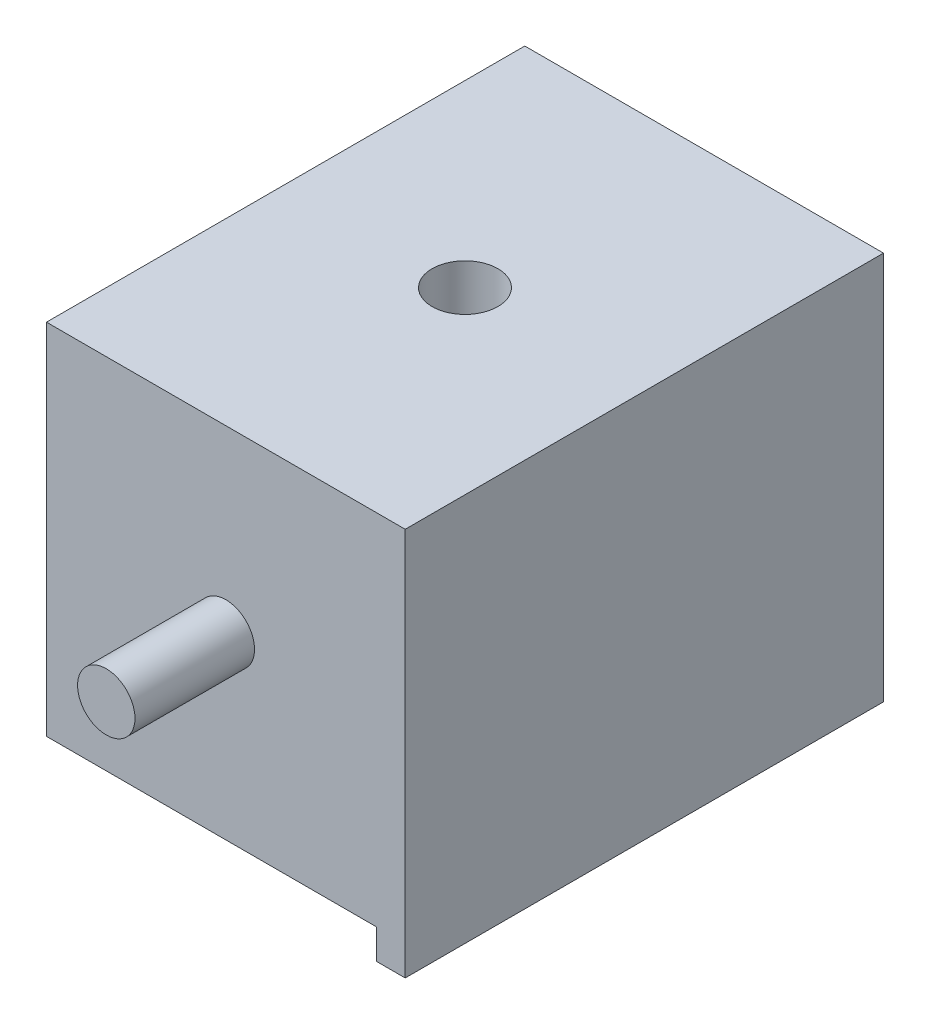
ISO-10303-21;
HEADER;
FILE_DESCRIPTION(('STEP AP214'),'2;1');
FILE_NAME('part.step','',(''),(''),'','','');
FILE_SCHEMA(('AUTOMOTIVE_DESIGN { 1 0 10303 214 1 1 1 1 }'));
ENDSEC;
DATA;
#1=APPLICATION_CONTEXT('core data for automotive mechanical design processes');
#2=APPLICATION_PROTOCOL_DEFINITION('international standard','automotive_design',2000,#1);
#3=PRODUCT_CONTEXT('',#1,'mechanical');
#4=PRODUCT('Part','Part','',(#3));
#5=PRODUCT_RELATED_PRODUCT_CATEGORY('part','',(#4));
#6=PRODUCT_DEFINITION_FORMATION('','',#4);
#7=PRODUCT_DEFINITION_CONTEXT('part definition',#1,'design');
#8=PRODUCT_DEFINITION('design','',#6,#7);
#9=PRODUCT_DEFINITION_SHAPE('','',#8);
#10=(LENGTH_UNIT() NAMED_UNIT(*) SI_UNIT(.MILLI.,.METRE.));
#11=(NAMED_UNIT(*) PLANE_ANGLE_UNIT() SI_UNIT($,.RADIAN.));
#12=(NAMED_UNIT(*) SI_UNIT($,.STERADIAN.) SOLID_ANGLE_UNIT());
#13=UNCERTAINTY_MEASURE_WITH_UNIT(LENGTH_MEASURE(1.E-05),#10,'distance_accuracy_value','');
#14=(GEOMETRIC_REPRESENTATION_CONTEXT(3) GLOBAL_UNCERTAINTY_ASSIGNED_CONTEXT((#13)) GLOBAL_UNIT_ASSIGNED_CONTEXT((#10,
#11,#12)) REPRESENTATION_CONTEXT('',''));
#15=CARTESIAN_POINT('',(0.,0.,0.));
#16=DIRECTION('',(0.,0.,1.));
#17=DIRECTION('',(1.,0.,0.));
#18=AXIS2_PLACEMENT_3D('',#15,#16,#17);
#19=CARTESIAN_POINT('',(-19.05,-19.05,25.4));
#20=DIRECTION('',(0.,1.,0.));
#21=DIRECTION('',(0.,0.,1.));
#22=AXIS2_PLACEMENT_3D('',#19,#20,#21);
#23=PLANE('',#22);
#24=CARTESIAN_POINT('',(0.,-19.05,0.));
#25=DIRECTION('',(0.,-1.,0.));
#26=DIRECTION('',(0.,0.,-1.));
#27=AXIS2_PLACEMENT_3D('',#24,#25,#26);
#28=CIRCLE('',#27,3.4925);
#29=CARTESIAN_POINT('',(0.,-19.05,-3.4925));
#30=VERTEX_POINT('',#29);
#31=EDGE_CURVE('E123',#30,#30,#28,.T.);
#32=ORIENTED_EDGE('',*,*,#31,.F.);
#33=EDGE_LOOP('',(#32));
#34=FACE_BOUND('',#33,.T.);
#35=DIRECTION('',(0.,0.,-1.));
#36=VECTOR('',#35,1.);
#37=CARTESIAN_POINT('',(16.002,-19.05,-25.4));
#38=LINE('',#37,#36);
#39=CARTESIAN_POINT('',(16.002,-19.05,25.4));
#40=VERTEX_POINT('',#39);
#41=CARTESIAN_POINT('',(16.002,-19.05,-25.4));
#42=VERTEX_POINT('',#41);
#43=EDGE_CURVE('E50',#40,#42,#38,.T.);
#44=ORIENTED_EDGE('',*,*,#43,.F.);
#45=DIRECTION('',(1.,0.,0.));
#46=VECTOR('',#45,1.);
#47=CARTESIAN_POINT('',(-19.05,-19.05,25.4));
#48=LINE('',#47,#46);
#49=CARTESIAN_POINT('',(-19.05,-19.05,25.4));
#50=VERTEX_POINT('',#49);
#51=EDGE_CURVE('E138',#50,#40,#48,.T.);
#52=ORIENTED_EDGE('',*,*,#51,.F.);
#53=DIRECTION('',(0.,0.,-1.));
#54=VECTOR('',#53,1.);
#55=CARTESIAN_POINT('',(-19.05,-19.05,25.4));
#56=LINE('',#55,#54);
#57=CARTESIAN_POINT('',(-19.05,-19.05,-25.4));
#58=VERTEX_POINT('',#57);
#59=EDGE_CURVE('E140',#50,#58,#56,.T.);
#60=ORIENTED_EDGE('',*,*,#59,.T.);
#61=DIRECTION('',(1.,0.,0.));
#62=VECTOR('',#61,1.);
#63=CARTESIAN_POINT('',(-19.05,-19.05,-25.4));
#64=LINE('',#63,#62);
#65=EDGE_CURVE('E104',#58,#42,#64,.T.);
#66=ORIENTED_EDGE('',*,*,#65,.T.);
#67=EDGE_LOOP('',(#44,#52,#60,#66));
#68=FACE_BOUND('',#67,.T.);
#69=ADVANCED_FACE('F35',(#34,#68),#23,.F.);
#70=CARTESIAN_POINT('',(19.05,-19.05,25.4));
#71=DIRECTION('',(-1.,0.,0.));
#72=DIRECTION('',(0.,0.,1.));
#73=AXIS2_PLACEMENT_3D('',#70,#71,#72);
#74=PLANE('',#73);
#75=DIRECTION('',(0.,1.,0.));
#76=VECTOR('',#75,1.);
#77=CARTESIAN_POINT('',(19.05,-19.05,-25.4));
#78=LINE('',#77,#76);
#79=CARTESIAN_POINT('',(19.05,-22.225,-25.4));
#80=VERTEX_POINT('',#79);
#81=CARTESIAN_POINT('',(19.05,19.05,-25.4));
#82=VERTEX_POINT('',#81);
#83=EDGE_CURVE('E134',#80,#82,#78,.T.);
#84=ORIENTED_EDGE('',*,*,#83,.T.);
#85=DIRECTION('',(0.,0.,-1.));
#86=VECTOR('',#85,1.);
#87=CARTESIAN_POINT('',(19.05,19.05,25.4));
#88=LINE('',#87,#86);
#89=CARTESIAN_POINT('',(19.05,19.05,25.4));
#90=VERTEX_POINT('',#89);
#91=EDGE_CURVE('E43',#90,#82,#88,.T.);
#92=ORIENTED_EDGE('',*,*,#91,.F.);
#93=DIRECTION('',(0.,1.,0.));
#94=VECTOR('',#93,1.);
#95=CARTESIAN_POINT('',(19.05,-19.05,25.4));
#96=LINE('',#95,#94);
#97=CARTESIAN_POINT('',(19.05,-22.225,25.4));
#98=VERTEX_POINT('',#97);
#99=EDGE_CURVE('E99',#98,#90,#96,.T.);
#100=ORIENTED_EDGE('',*,*,#99,.F.);
#101=DIRECTION('',(0.,0.,1.));
#102=VECTOR('',#101,1.);
#103=CARTESIAN_POINT('',(19.05,-22.225,-25.4));
#104=LINE('',#103,#102);
#105=EDGE_CURVE('E103',#80,#98,#104,.T.);
#106=ORIENTED_EDGE('',*,*,#105,.F.);
#107=EDGE_LOOP('',(#84,#92,#100,#106));
#108=FACE_BOUND('',#107,.T.);
#109=ADVANCED_FACE('F37',(#108),#74,.F.);
#110=CARTESIAN_POINT('',(-19.05,19.05,25.4));
#111=DIRECTION('',(0.,-1.,0.));
#112=DIRECTION('',(0.,0.,-1.));
#113=AXIS2_PLACEMENT_3D('',#110,#111,#112);
#114=PLANE('',#113);
#115=CARTESIAN_POINT('',(0.,19.05,0.));
#116=DIRECTION('',(0.,-1.,0.));
#117=DIRECTION('',(0.,0.,-1.));
#118=AXIS2_PLACEMENT_3D('',#115,#116,#117);
#119=CIRCLE('',#118,3.4925);
#120=CARTESIAN_POINT('',(0.,19.05,-3.4925));
#121=VERTEX_POINT('',#120);
#122=EDGE_CURVE('E120',#121,#121,#119,.T.);
#123=ORIENTED_EDGE('',*,*,#122,.T.);
#124=EDGE_LOOP('',(#123));
#125=FACE_BOUND('',#124,.T.);
#126=DIRECTION('',(-1.,0.,0.));
#127=VECTOR('',#126,1.);
#128=CARTESIAN_POINT('',(-19.05,19.05,-25.4));
#129=LINE('',#128,#127);
#130=CARTESIAN_POINT('',(-19.05,19.05,-25.4));
#131=VERTEX_POINT('',#130);
#132=EDGE_CURVE('E142',#82,#131,#129,.T.);
#133=ORIENTED_EDGE('',*,*,#132,.T.);
#134=DIRECTION('',(0.,0.,-1.));
#135=VECTOR('',#134,1.);
#136=CARTESIAN_POINT('',(-19.05,19.05,25.4));
#137=LINE('',#136,#135);
#138=CARTESIAN_POINT('',(-19.05,19.05,25.4));
#139=VERTEX_POINT('',#138);
#140=EDGE_CURVE('E147',#139,#131,#137,.T.);
#141=ORIENTED_EDGE('',*,*,#140,.F.);
#142=DIRECTION('',(-1.,0.,0.));
#143=VECTOR('',#142,1.);
#144=CARTESIAN_POINT('',(-19.05,19.05,25.4));
#145=LINE('',#144,#143);
#146=EDGE_CURVE('E81',#90,#139,#145,.T.);
#147=ORIENTED_EDGE('',*,*,#146,.F.);
#148=ORIENTED_EDGE('',*,*,#91,.T.);
#149=EDGE_LOOP('',(#133,#141,#147,#148));
#150=FACE_BOUND('',#149,.T.);
#151=ADVANCED_FACE('F148',(#125,#150),#114,.F.);
#152=CARTESIAN_POINT('',(-19.05,-19.05,25.4));
#153=DIRECTION('',(1.,0.,0.));
#154=DIRECTION('',(0.,0.,-1.));
#155=AXIS2_PLACEMENT_3D('',#152,#153,#154);
#156=PLANE('',#155);
#157=DIRECTION('',(0.,-1.,0.));
#158=VECTOR('',#157,1.);
#159=CARTESIAN_POINT('',(-19.05,-19.05,-25.4));
#160=LINE('',#159,#158);
#161=EDGE_CURVE('E75',#131,#58,#160,.T.);
#162=ORIENTED_EDGE('',*,*,#161,.T.);
#163=ORIENTED_EDGE('',*,*,#59,.F.);
#164=DIRECTION('',(0.,-1.,0.));
#165=VECTOR('',#164,1.);
#166=CARTESIAN_POINT('',(-19.05,-19.05,25.4));
#167=LINE('',#166,#165);
#168=EDGE_CURVE('E58',#139,#50,#167,.T.);
#169=ORIENTED_EDGE('',*,*,#168,.F.);
#170=ORIENTED_EDGE('',*,*,#140,.T.);
#171=EDGE_LOOP('',(#162,#163,#169,#170));
#172=FACE_BOUND('',#171,.T.);
#173=ADVANCED_FACE('F177',(#172),#156,.F.);
#174=CARTESIAN_POINT('',(0.,0.,25.4));
#175=DIRECTION('',(0.,0.,-1.));
#176=DIRECTION('',(-1.,0.,0.));
#177=AXIS2_PLACEMENT_3D('',#174,#175,#176);
#178=PLANE('',#177);
#179=CARTESIAN_POINT('',(0.,0.,25.4));
#180=DIRECTION('',(0.,0.,-1.));
#181=DIRECTION('',(-1.,0.,0.));
#182=AXIS2_PLACEMENT_3D('',#179,#180,#181);
#183=CIRCLE('',#182,3.048);
#184=CARTESIAN_POINT('',(-3.048,0.,25.4));
#185=VERTEX_POINT('',#184);
#186=EDGE_CURVE('E11',#185,#185,#183,.F.);
#187=ORIENTED_EDGE('',*,*,#186,.F.);
#188=EDGE_LOOP('',(#187));
#189=FACE_BOUND('',#188,.T.);
#190=ORIENTED_EDGE('',*,*,#99,.T.);
#191=ORIENTED_EDGE('',*,*,#146,.T.);
#192=ORIENTED_EDGE('',*,*,#168,.T.);
#193=ORIENTED_EDGE('',*,*,#51,.T.);
#194=DIRECTION('',(0.,1.,0.));
#195=VECTOR('',#194,1.);
#196=CARTESIAN_POINT('',(16.002,-22.225,25.4));
#197=LINE('',#196,#195);
#198=CARTESIAN_POINT('',(16.002,-22.225,25.4));
#199=VERTEX_POINT('',#198);
#200=EDGE_CURVE('E110',#199,#40,#197,.T.);
#201=ORIENTED_EDGE('',*,*,#200,.F.);
#202=DIRECTION('',(-1.,0.,0.));
#203=VECTOR('',#202,1.);
#204=CARTESIAN_POINT('',(19.05,-22.225,25.4));
#205=LINE('',#204,#203);
#206=EDGE_CURVE('E107',#98,#199,#205,.T.);
#207=ORIENTED_EDGE('',*,*,#206,.F.);
#208=EDGE_LOOP('',(#190,#191,#192,#193,#201,#207));
#209=FACE_BOUND('',#208,.T.);
#210=ADVANCED_FACE('F108',(#189,#209),#178,.F.);
#211=CARTESIAN_POINT('',(0.,0.,-25.4));
#212=DIRECTION('',(0.,0.,-1.));
#213=DIRECTION('',(-1.,0.,0.));
#214=AXIS2_PLACEMENT_3D('',#211,#212,#213);
#215=PLANE('',#214);
#216=ORIENTED_EDGE('',*,*,#83,.F.);
#217=DIRECTION('',(1.,0.,0.));
#218=VECTOR('',#217,1.);
#219=CARTESIAN_POINT('',(19.05,-22.225,-25.4));
#220=LINE('',#219,#218);
#221=CARTESIAN_POINT('',(16.002,-22.225,-25.4));
#222=VERTEX_POINT('',#221);
#223=EDGE_CURVE('E118',#222,#80,#220,.T.);
#224=ORIENTED_EDGE('',*,*,#223,.F.);
#225=DIRECTION('',(0.,1.,0.));
#226=VECTOR('',#225,1.);
#227=CARTESIAN_POINT('',(16.002,-22.225,-25.4));
#228=LINE('',#227,#226);
#229=EDGE_CURVE('E127',#222,#42,#228,.T.);
#230=ORIENTED_EDGE('',*,*,#229,.T.);
#231=ORIENTED_EDGE('',*,*,#65,.F.);
#232=ORIENTED_EDGE('',*,*,#161,.F.);
#233=ORIENTED_EDGE('',*,*,#132,.F.);
#234=EDGE_LOOP('',(#216,#224,#230,#231,#232,#233));
#235=FACE_BOUND('',#234,.T.);
#236=ADVANCED_FACE('F150',(#235),#215,.T.);
#237=CARTESIAN_POINT('',(0.,0.,38.1));
#238=DIRECTION('',(0.,0.,-1.));
#239=DIRECTION('',(-1.,0.,0.));
#240=AXIS2_PLACEMENT_3D('',#237,#238,#239);
#241=CYLINDRICAL_SURFACE('',#240,3.048);
#242=CARTESIAN_POINT('',(0.,0.,38.1));
#243=DIRECTION('',(0.,0.,1.));
#244=DIRECTION('',(1.,0.,0.));
#245=AXIS2_PLACEMENT_3D('',#242,#243,#244);
#246=CIRCLE('',#245,3.048);
#247=CARTESIAN_POINT('',(3.048,0.,38.1));
#248=VERTEX_POINT('',#247);
#249=EDGE_CURVE('E132',#248,#248,#246,.T.);
#250=ORIENTED_EDGE('',*,*,#249,.F.);
#251=EDGE_LOOP('',(#250));
#252=FACE_BOUND('',#251,.T.);
#253=ORIENTED_EDGE('',*,*,#186,.T.);
#254=EDGE_LOOP('',(#253));
#255=FACE_BOUND('',#254,.T.);
#256=ADVANCED_FACE('F164',(#252,#255),#241,.T.);
#257=CARTESIAN_POINT('',(0.,0.,38.1));
#258=DIRECTION('',(0.,0.,1.));
#259=DIRECTION('',(1.,0.,0.));
#260=AXIS2_PLACEMENT_3D('',#257,#258,#259);
#261=PLANE('',#260);
#262=ORIENTED_EDGE('',*,*,#249,.T.);
#263=EDGE_LOOP('',(#262));
#264=FACE_BOUND('',#263,.T.);
#265=ADVANCED_FACE('F156',(#264),#261,.T.);
#266=CARTESIAN_POINT('',(16.002,-22.225,-25.4));
#267=DIRECTION('',(1.,0.,0.));
#268=DIRECTION('',(0.,0.,-1.));
#269=AXIS2_PLACEMENT_3D('',#266,#267,#268);
#270=PLANE('',#269);
#271=ORIENTED_EDGE('',*,*,#43,.T.);
#272=ORIENTED_EDGE('',*,*,#229,.F.);
#273=DIRECTION('',(0.,0.,-1.));
#274=VECTOR('',#273,1.);
#275=CARTESIAN_POINT('',(16.002,-22.225,-25.4));
#276=LINE('',#275,#274);
#277=EDGE_CURVE('E113',#199,#222,#276,.T.);
#278=ORIENTED_EDGE('',*,*,#277,.F.);
#279=ORIENTED_EDGE('',*,*,#200,.T.);
#280=EDGE_LOOP('',(#271,#272,#278,#279));
#281=FACE_BOUND('',#280,.T.);
#282=ADVANCED_FACE('F154',(#281),#270,.F.);
#283=CARTESIAN_POINT('',(0.,-22.225,0.));
#284=DIRECTION('',(0.,-1.,0.));
#285=DIRECTION('',(0.,0.,-1.));
#286=AXIS2_PLACEMENT_3D('',#283,#284,#285);
#287=PLANE('',#286);
#288=ORIENTED_EDGE('',*,*,#105,.T.);
#289=ORIENTED_EDGE('',*,*,#206,.T.);
#290=ORIENTED_EDGE('',*,*,#277,.T.);
#291=ORIENTED_EDGE('',*,*,#223,.T.);
#292=EDGE_LOOP('',(#288,#289,#290,#291));
#293=FACE_BOUND('',#292,.T.);
#294=ADVANCED_FACE('F116',(#293),#287,.T.);
#295=CARTESIAN_POINT('',(0.,19.05,0.));
#296=DIRECTION('',(0.,-1.,0.));
#297=DIRECTION('',(0.,0.,-1.));
#298=AXIS2_PLACEMENT_3D('',#295,#296,#297);
#299=CYLINDRICAL_SURFACE('',#298,3.4925);
#300=CARTESIAN_POINT('',(0.,19.05,-3.4925));
#301=CARTESIAN_POINT('',(0.,18.653125,-3.4925));
#302=CARTESIAN_POINT('',(0.,18.25625,-3.4925));
#303=CARTESIAN_POINT('',(0.,17.4625,-3.4925));
#304=CARTESIAN_POINT('',(0.,17.065625,-3.4925));
#305=CARTESIAN_POINT('',(0.,16.271875,-3.4925));
#306=CARTESIAN_POINT('',(0.,15.875,-3.4925));
#307=CARTESIAN_POINT('',(0.,15.08125,-3.4925));
#308=CARTESIAN_POINT('',(0.,14.684375,-3.4925));
#309=CARTESIAN_POINT('',(0.,13.890625,-3.4925));
#310=CARTESIAN_POINT('',(0.,13.49375,-3.4925));
#311=CARTESIAN_POINT('',(0.,12.7,-3.4925));
#312=CARTESIAN_POINT('',(0.,12.303125,-3.4925));
#313=CARTESIAN_POINT('',(0.,11.509375,-3.4925));
#314=CARTESIAN_POINT('',(0.,11.1125,-3.4925));
#315=CARTESIAN_POINT('',(0.,10.31875,-3.4925));
#316=CARTESIAN_POINT('',(0.,9.921875,-3.4925));
#317=CARTESIAN_POINT('',(0.,9.128125,-3.4925));
#318=CARTESIAN_POINT('',(0.,8.73125,-3.4925));
#319=CARTESIAN_POINT('',(0.,7.9375,-3.4925));
#320=CARTESIAN_POINT('',(0.,7.540625,-3.4925));
#321=CARTESIAN_POINT('',(0.,6.746875,-3.4925));
#322=CARTESIAN_POINT('',(0.,6.35,-3.4925));
#323=CARTESIAN_POINT('',(0.,5.55625,-3.4925));
#324=CARTESIAN_POINT('',(0.,5.159375,-3.4925));
#325=CARTESIAN_POINT('',(0.,4.365625,-3.4925));
#326=CARTESIAN_POINT('',(0.,3.96875,-3.4925));
#327=CARTESIAN_POINT('',(0.,3.175,-3.4925));
#328=CARTESIAN_POINT('',(0.,2.778125,-3.4925));
#329=CARTESIAN_POINT('',(0.,1.984375,-3.4925));
#330=CARTESIAN_POINT('',(0.,1.5875,-3.4925));
#331=CARTESIAN_POINT('',(0.,0.793749999999997,-3.4925));
#332=CARTESIAN_POINT('',(0.,0.396874999999997,-3.4925));
#333=CARTESIAN_POINT('',(0.,-0.396875000000004,-3.4925));
#334=CARTESIAN_POINT('',(0.,-0.793750000000004,-3.4925));
#335=CARTESIAN_POINT('',(0.,-1.5875,-3.4925));
#336=CARTESIAN_POINT('',(0.,-1.984375,-3.4925));
#337=CARTESIAN_POINT('',(0.,-2.77812500000001,-3.4925));
#338=CARTESIAN_POINT('',(0.,-3.17500000000001,-3.4925));
#339=CARTESIAN_POINT('',(0.,-3.96875000000001,-3.4925));
#340=CARTESIAN_POINT('',(0.,-4.36562500000001,-3.4925));
#341=CARTESIAN_POINT('',(0.,-5.15937500000001,-3.4925));
#342=CARTESIAN_POINT('',(0.,-5.55625,-3.4925));
#343=CARTESIAN_POINT('',(0.,-6.35,-3.4925));
#344=CARTESIAN_POINT('',(0.,-6.746875,-3.4925));
#345=CARTESIAN_POINT('',(0.,-7.540625,-3.4925));
#346=CARTESIAN_POINT('',(0.,-7.93750000000001,-3.4925));
#347=CARTESIAN_POINT('',(0.,-8.73125,-3.4925));
#348=CARTESIAN_POINT('',(0.,-9.12812500000001,-3.4925));
#349=CARTESIAN_POINT('',(0.,-9.92187500000001,-3.4925));
#350=CARTESIAN_POINT('',(0.,-10.31875,-3.4925));
#351=CARTESIAN_POINT('',(0.,-11.1125,-3.4925));
#352=CARTESIAN_POINT('',(0.,-11.509375,-3.4925));
#353=CARTESIAN_POINT('',(0.,-12.303125,-3.4925));
#354=CARTESIAN_POINT('',(0.,-12.7,-3.4925));
#355=CARTESIAN_POINT('',(0.,-13.49375,-3.4925));
#356=CARTESIAN_POINT('',(0.,-13.890625,-3.4925));
#357=CARTESIAN_POINT('',(0.,-14.684375,-3.4925));
#358=CARTESIAN_POINT('',(0.,-15.08125,-3.4925));
#359=CARTESIAN_POINT('',(0.,-15.875,-3.4925));
#360=CARTESIAN_POINT('',(0.,-16.271875,-3.4925));
#361=CARTESIAN_POINT('',(0.,-17.065625,-3.4925));
#362=CARTESIAN_POINT('',(0.,-17.4625,-3.4925));
#363=CARTESIAN_POINT('',(0.,-18.25625,-3.4925));
#364=CARTESIAN_POINT('',(0.,-18.653125,-3.4925));
#365=CARTESIAN_POINT('',(0.,-19.05,-3.4925));
#366=B_SPLINE_CURVE_WITH_KNOTS('',3,(#300,#301,#302,#303,#304,#305,#306,#307,#308,#309,#310,
#311,#312,#313,#314,#315,#316,#317,#318,#319,#320,#321,#322,#323,#324,#325,#326,#327,#328,#329,
#330,#331,#332,#333,#334,#335,#336,#337,#338,#339,#340,#341,#342,#343,#344,#345,#346,#347,#348,
#349,#350,#351,#352,#353,#354,#355,#356,#357,#358,#359,#360,#361,#362,#363,#364,#365),
.UNSPECIFIED.,.F.,.F.,(4,2,2,2,2,2,2,2,2,2,2,2,2,2,2,2,2,2,2,2,2,2,2,2,2,2,2,2,2,2,2,2,4),(0.,
1.190625,2.38125,3.571875,4.7625,5.953125,7.14375,8.334375,9.525,10.715625,11.90625,13.096875,
14.2875,15.478125,16.66875,17.859375,19.05,20.240625,21.43125,22.621875,23.8125,25.003125,
26.19375,27.384375,28.575,29.765625,30.95625,32.146875,33.3375,34.528125,35.71875,36.909375,
38.1),.UNSPECIFIED.);
#367=EDGE_CURVE('BSEAM162',#121,#30,#366,.T.);
#368=ORIENTED_EDGE('',*,*,#122,.F.);
#369=ORIENTED_EDGE('',*,*,#31,.T.);
#370=ORIENTED_EDGE('',*,*,#367,.T.);
#371=ORIENTED_EDGE('',*,*,#367,.F.);
#372=EDGE_LOOP('',(#368,#370,#369,#371));
#373=FACE_BOUND('',#372,.T.);
#374=ADVANCED_FACE('F162',(#373),#299,.F.);
#375=CLOSED_SHELL('',(#69,#109,#151,#173,#210,#236,#256,#265,#282,#294,#374));
#376=MANIFOLD_SOLID_BREP('B2',#375);
#377=ADVANCED_BREP_SHAPE_REPRESENTATION('',(#18,#376),#14);
#378=SHAPE_DEFINITION_REPRESENTATION(#9,#377);
ENDSEC;
END-ISO-10303-21;
